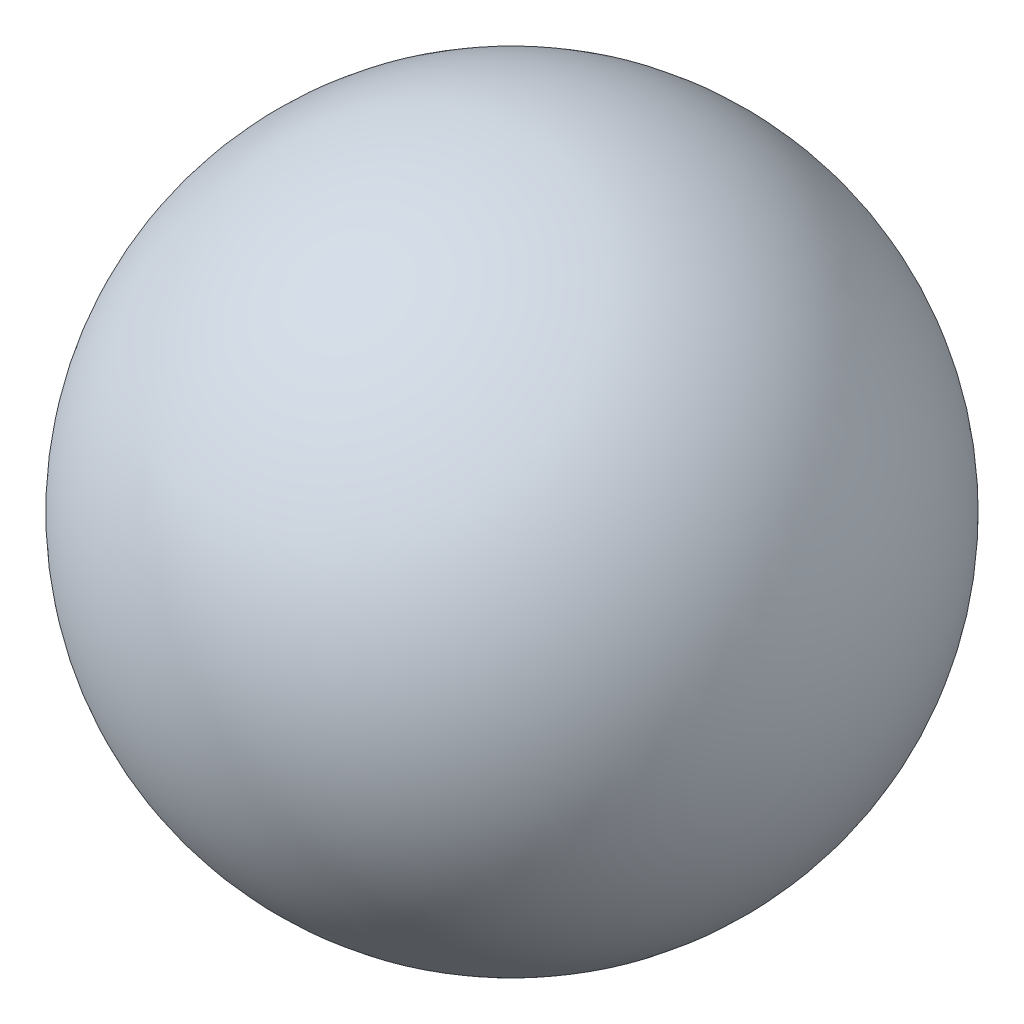
ISO-10303-21;
HEADER;
FILE_DESCRIPTION(('STEP AP214'),'2;1');
FILE_NAME('part.step','',(''),(''),'','','');
FILE_SCHEMA(('AUTOMOTIVE_DESIGN { 1 0 10303 214 1 1 1 1 }'));
ENDSEC;
DATA;
#1=APPLICATION_CONTEXT('core data for automotive mechanical design processes');
#2=APPLICATION_PROTOCOL_DEFINITION('international standard','automotive_design',2000,#1);
#3=PRODUCT_CONTEXT('',#1,'mechanical');
#4=PRODUCT('Part','Part','',(#3));
#5=PRODUCT_RELATED_PRODUCT_CATEGORY('part','',(#4));
#6=PRODUCT_DEFINITION_FORMATION('','',#4);
#7=PRODUCT_DEFINITION_CONTEXT('part definition',#1,'design');
#8=PRODUCT_DEFINITION('design','',#6,#7);
#9=PRODUCT_DEFINITION_SHAPE('','',#8);
#10=(LENGTH_UNIT() NAMED_UNIT(*) SI_UNIT(.MILLI.,.METRE.));
#11=(NAMED_UNIT(*) PLANE_ANGLE_UNIT() SI_UNIT($,.RADIAN.));
#12=(NAMED_UNIT(*) SI_UNIT($,.STERADIAN.) SOLID_ANGLE_UNIT());
#13=UNCERTAINTY_MEASURE_WITH_UNIT(LENGTH_MEASURE(1.E-05),#10,'distance_accuracy_value','');
#14=(GEOMETRIC_REPRESENTATION_CONTEXT(3) GLOBAL_UNCERTAINTY_ASSIGNED_CONTEXT((#13)) GLOBAL_UNIT_ASSIGNED_CONTEXT((#10,
#11,#12)) REPRESENTATION_CONTEXT('',''));
#15=CARTESIAN_POINT('',(0.,0.,0.));
#16=DIRECTION('',(0.,0.,1.));
#17=DIRECTION('',(1.,0.,0.));
#18=AXIS2_PLACEMENT_3D('',#15,#16,#17);
#19=CARTESIAN_POINT('',(0.,0.,0.));
#20=DIRECTION('',(0.,1.,0.));
#21=DIRECTION('',(0.,0.,-1.));
#22=AXIS2_PLACEMENT_3D('',#19,#20,#21);
#23=SPHERICAL_SURFACE('',#22,1.75);
#24=CARTESIAN_POINT('',(0.,1.75,0.));
#25=VERTEX_POINT('',#24);
#26=VERTEX_LOOP('',#25);
#27=FACE_BOUND('',#26,.T.);
#28=ADVANCED_FACE('F29',(#27),#23,.T.);
#29=CLOSED_SHELL('',(#28));
#30=MANIFOLD_SOLID_BREP('B2',#29);
#31=ADVANCED_BREP_SHAPE_REPRESENTATION('',(#18,#30),#14);
#32=SHAPE_DEFINITION_REPRESENTATION(#9,#31);
ENDSEC;
END-ISO-10303-21;
